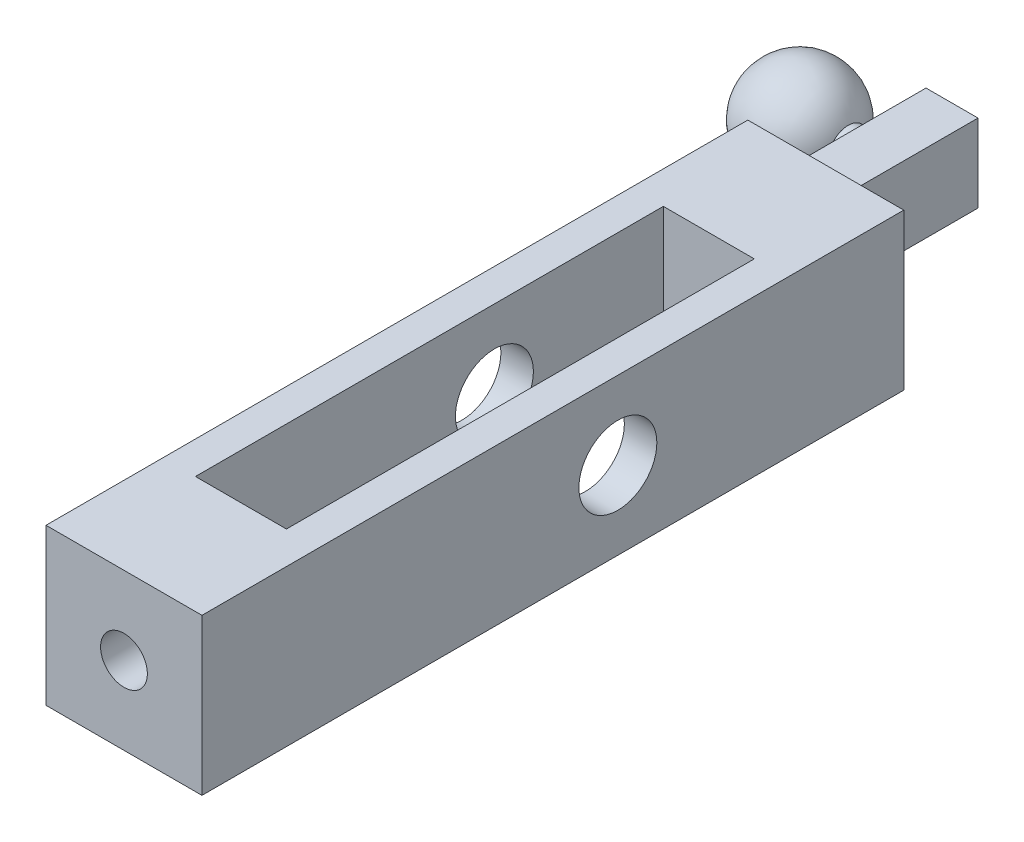
ISO-10303-21;
HEADER;
FILE_DESCRIPTION(('STEP AP214'),'2;1');
FILE_NAME('part.step','',(''),(''),'','','');
FILE_SCHEMA(('AUTOMOTIVE_DESIGN { 1 0 10303 214 1 1 1 1 }'));
ENDSEC;
DATA;
#1=APPLICATION_CONTEXT('core data for automotive mechanical design processes');
#2=APPLICATION_PROTOCOL_DEFINITION('international standard','automotive_design',2000,#1);
#3=PRODUCT_CONTEXT('',#1,'mechanical');
#4=PRODUCT('Part','Part','',(#3));
#5=PRODUCT_RELATED_PRODUCT_CATEGORY('part','',(#4));
#6=PRODUCT_DEFINITION_FORMATION('','',#4);
#7=PRODUCT_DEFINITION_CONTEXT('part definition',#1,'design');
#8=PRODUCT_DEFINITION('design','',#6,#7);
#9=PRODUCT_DEFINITION_SHAPE('','',#8);
#10=(LENGTH_UNIT() NAMED_UNIT(*) SI_UNIT(.MILLI.,.METRE.));
#11=(NAMED_UNIT(*) PLANE_ANGLE_UNIT() SI_UNIT($,.RADIAN.));
#12=(NAMED_UNIT(*) SI_UNIT($,.STERADIAN.) SOLID_ANGLE_UNIT());
#13=UNCERTAINTY_MEASURE_WITH_UNIT(LENGTH_MEASURE(1.E-05),#10,'distance_accuracy_value','');
#14=(GEOMETRIC_REPRESENTATION_CONTEXT(3) GLOBAL_UNCERTAINTY_ASSIGNED_CONTEXT((#13)) GLOBAL_UNIT_ASSIGNED_CONTEXT((#10,
#11,#12)) REPRESENTATION_CONTEXT('',''));
#15=CARTESIAN_POINT('',(0.,0.,0.));
#16=DIRECTION('',(0.,0.,1.));
#17=DIRECTION('',(1.,0.,0.));
#18=AXIS2_PLACEMENT_3D('',#15,#16,#17);
#19=CARTESIAN_POINT('',(3.,-3.,-27.));
#20=DIRECTION('',(0.,1.,0.));
#21=DIRECTION('',(-1.,0.,0.));
#22=AXIS2_PLACEMENT_3D('',#19,#20,#21);
#23=PLANE('',#22);
#24=DIRECTION('',(1.,0.,0.));
#25=VECTOR('',#24,1.);
#26=CARTESIAN_POINT('',(3.,-3.,0.));
#27=LINE('',#26,#25);
#28=CARTESIAN_POINT('',(-3.,-3.,0.));
#29=VERTEX_POINT('',#28);
#30=CARTESIAN_POINT('',(3.,-3.,0.));
#31=VERTEX_POINT('',#30);
#32=EDGE_CURVE('E224',#29,#31,#27,.T.);
#33=ORIENTED_EDGE('',*,*,#32,.F.);
#34=DIRECTION('',(0.,0.,1.));
#35=VECTOR('',#34,1.);
#36=CARTESIAN_POINT('',(-3.,-3.,-27.));
#37=LINE('',#36,#35);
#38=CARTESIAN_POINT('',(-3.,-3.,-27.));
#39=VERTEX_POINT('',#38);
#40=EDGE_CURVE('E52',#39,#29,#37,.T.);
#41=ORIENTED_EDGE('',*,*,#40,.F.);
#42=DIRECTION('',(1.,0.,0.));
#43=VECTOR('',#42,1.);
#44=CARTESIAN_POINT('',(3.,-3.,-27.));
#45=LINE('',#44,#43);
#46=CARTESIAN_POINT('',(3.,-3.,-27.));
#47=VERTEX_POINT('',#46);
#48=EDGE_CURVE('E213',#39,#47,#45,.T.);
#49=ORIENTED_EDGE('',*,*,#48,.T.);
#50=DIRECTION('',(0.,0.,1.));
#51=VECTOR('',#50,1.);
#52=CARTESIAN_POINT('',(3.,-3.,-27.));
#53=LINE('',#52,#51);
#54=EDGE_CURVE('E236',#47,#31,#53,.T.);
#55=ORIENTED_EDGE('',*,*,#54,.T.);
#56=EDGE_LOOP('',(#33,#41,#49,#55));
#57=FACE_BOUND('',#56,.T.);
#58=DIRECTION('',(1.,0.,0.));
#59=VECTOR('',#58,1.);
#60=CARTESIAN_POINT('',(3.,-3.,-4.5));
#61=LINE('',#60,#59);
#62=CARTESIAN_POINT('',(-1.75,-3.,-4.5));
#63=VERTEX_POINT('',#62);
#64=CARTESIAN_POINT('',(1.75,-3.,-4.5));
#65=VERTEX_POINT('',#64);
#66=EDGE_CURVE('E174',#63,#65,#61,.T.);
#67=ORIENTED_EDGE('',*,*,#66,.T.);
#68=DIRECTION('',(0.,0.,-1.));
#69=VECTOR('',#68,1.);
#70=CARTESIAN_POINT('',(1.75,-3.,-27.));
#71=LINE('',#70,#69);
#72=CARTESIAN_POINT('',(1.75,-3.,-22.5));
#73=VERTEX_POINT('',#72);
#74=EDGE_CURVE('E142',#65,#73,#71,.T.);
#75=ORIENTED_EDGE('',*,*,#74,.T.);
#76=DIRECTION('',(-1.,0.,0.));
#77=VECTOR('',#76,1.);
#78=CARTESIAN_POINT('',(3.,-3.,-22.5));
#79=LINE('',#78,#77);
#80=CARTESIAN_POINT('',(-1.75,-3.,-22.5));
#81=VERTEX_POINT('',#80);
#82=EDGE_CURVE('E170',#73,#81,#79,.T.);
#83=ORIENTED_EDGE('',*,*,#82,.T.);
#84=DIRECTION('',(0.,0.,1.));
#85=VECTOR('',#84,1.);
#86=CARTESIAN_POINT('',(-1.75,-3.,-27.));
#87=LINE('',#86,#85);
#88=EDGE_CURVE('E144',#81,#63,#87,.T.);
#89=ORIENTED_EDGE('',*,*,#88,.T.);
#90=EDGE_LOOP('',(#67,#75,#83,#89));
#91=FACE_BOUND('',#90,.T.);
#92=ADVANCED_FACE('F43',(#57,#91),#23,.F.);
#93=CARTESIAN_POINT('',(3.,3.,-27.));
#94=DIRECTION('',(0.,-1.,0.));
#95=DIRECTION('',(1.,0.,0.));
#96=AXIS2_PLACEMENT_3D('',#93,#94,#95);
#97=PLANE('',#96);
#98=DIRECTION('',(-1.,0.,0.));
#99=VECTOR('',#98,1.);
#100=CARTESIAN_POINT('',(3.,3.,0.));
#101=LINE('',#100,#99);
#102=CARTESIAN_POINT('',(3.,3.,0.));
#103=VERTEX_POINT('',#102);
#104=CARTESIAN_POINT('',(-3.,3.,0.));
#105=VERTEX_POINT('',#104);
#106=EDGE_CURVE('E214',#103,#105,#101,.T.);
#107=ORIENTED_EDGE('',*,*,#106,.F.);
#108=DIRECTION('',(0.,0.,1.));
#109=VECTOR('',#108,1.);
#110=CARTESIAN_POINT('',(3.,3.,-27.));
#111=LINE('',#110,#109);
#112=CARTESIAN_POINT('',(3.,3.,-27.));
#113=VERTEX_POINT('',#112);
#114=EDGE_CURVE('E233',#113,#103,#111,.T.);
#115=ORIENTED_EDGE('',*,*,#114,.F.);
#116=DIRECTION('',(-1.,0.,0.));
#117=VECTOR('',#116,1.);
#118=CARTESIAN_POINT('',(3.,3.,-27.));
#119=LINE('',#118,#117);
#120=CARTESIAN_POINT('',(-3.,3.,-27.));
#121=VERTEX_POINT('',#120);
#122=EDGE_CURVE('E219',#113,#121,#119,.T.);
#123=ORIENTED_EDGE('',*,*,#122,.T.);
#124=DIRECTION('',(0.,0.,1.));
#125=VECTOR('',#124,1.);
#126=CARTESIAN_POINT('',(-3.,3.,-27.));
#127=LINE('',#126,#125);
#128=EDGE_CURVE('E222',#121,#105,#127,.T.);
#129=ORIENTED_EDGE('',*,*,#128,.T.);
#130=EDGE_LOOP('',(#107,#115,#123,#129));
#131=FACE_BOUND('',#130,.T.);
#132=DIRECTION('',(1.,0.,0.));
#133=VECTOR('',#132,1.);
#134=CARTESIAN_POINT('',(-1.75,3.,-4.5));
#135=LINE('',#134,#133);
#136=CARTESIAN_POINT('',(-1.75,3.,-4.5));
#137=VERTEX_POINT('',#136);
#138=CARTESIAN_POINT('',(1.75,3.,-4.5));
#139=VERTEX_POINT('',#138);
#140=EDGE_CURVE('E151',#137,#139,#135,.T.);
#141=ORIENTED_EDGE('',*,*,#140,.F.);
#142=DIRECTION('',(0.,0.,1.));
#143=VECTOR('',#142,1.);
#144=CARTESIAN_POINT('',(-1.75,3.,-4.5));
#145=LINE('',#144,#143);
#146=CARTESIAN_POINT('',(-1.75,3.,-22.5));
#147=VERTEX_POINT('',#146);
#148=EDGE_CURVE('E163',#147,#137,#145,.T.);
#149=ORIENTED_EDGE('',*,*,#148,.F.);
#150=DIRECTION('',(-1.,0.,0.));
#151=VECTOR('',#150,1.);
#152=CARTESIAN_POINT('',(-1.75,3.,-22.5));
#153=LINE('',#152,#151);
#154=CARTESIAN_POINT('',(1.75,3.,-22.5));
#155=VERTEX_POINT('',#154);
#156=EDGE_CURVE('E152',#155,#147,#153,.T.);
#157=ORIENTED_EDGE('',*,*,#156,.F.);
#158=DIRECTION('',(0.,0.,-1.));
#159=VECTOR('',#158,1.);
#160=CARTESIAN_POINT('',(1.75,3.,-4.5));
#161=LINE('',#160,#159);
#162=EDGE_CURVE('E139',#139,#155,#161,.T.);
#163=ORIENTED_EDGE('',*,*,#162,.F.);
#164=EDGE_LOOP('',(#141,#149,#157,#163));
#165=FACE_BOUND('',#164,.T.);
#166=ADVANCED_FACE('F149',(#131,#165),#97,.F.);
#167=CARTESIAN_POINT('',(0.,0.,-27.));
#168=DIRECTION('',(0.,0.,-1.));
#169=DIRECTION('',(1.,0.,0.));
#170=AXIS2_PLACEMENT_3D('',#167,#168,#169);
#171=PLANE('',#170);
#172=DIRECTION('',(0.,-1.,0.));
#173=VECTOR('',#172,1.);
#174=CARTESIAN_POINT('',(-3.,-3.,-27.));
#175=LINE('',#174,#173);
#176=EDGE_CURVE('E211',#121,#39,#175,.T.);
#177=ORIENTED_EDGE('',*,*,#176,.F.);
#178=ORIENTED_EDGE('',*,*,#122,.F.);
#179=DIRECTION('',(0.,1.,0.));
#180=VECTOR('',#179,1.);
#181=CARTESIAN_POINT('',(3.,-3.,-27.));
#182=LINE('',#181,#180);
#183=EDGE_CURVE('E217',#47,#113,#182,.T.);
#184=ORIENTED_EDGE('',*,*,#183,.F.);
#185=ORIENTED_EDGE('',*,*,#48,.F.);
#186=EDGE_LOOP('',(#177,#178,#184,#185));
#187=FACE_BOUND('',#186,.T.);
#188=DIRECTION('',(-1.,0.,0.));
#189=VECTOR('',#188,1.);
#190=CARTESIAN_POINT('',(-2.14479354998716,1.49545918544692,-27.));
#191=LINE('',#190,#189);
#192=CARTESIAN_POINT('',(-0.144793549987163,1.49545918544692,-27.));
#193=VERTEX_POINT('',#192);
#194=CARTESIAN_POINT('',(-2.14479354998716,1.49545918544692,-27.));
#195=VERTEX_POINT('',#194);
#196=EDGE_CURVE('E195',#193,#195,#191,.T.);
#197=ORIENTED_EDGE('',*,*,#196,.T.);
#198=DIRECTION('',(0.,-1.,0.));
#199=VECTOR('',#198,1.);
#200=CARTESIAN_POINT('',(-2.14479354998716,1.49545918544692,-27.));
#201=LINE('',#200,#199);
#202=CARTESIAN_POINT('',(-2.14479354998716,-1.50454081455308,-27.));
#203=VERTEX_POINT('',#202);
#204=EDGE_CURVE('E198',#195,#203,#201,.T.);
#205=ORIENTED_EDGE('',*,*,#204,.T.);
#206=DIRECTION('',(1.,0.,0.));
#207=VECTOR('',#206,1.);
#208=CARTESIAN_POINT('',(-2.14479354998716,-1.50454081455308,-27.));
#209=LINE('',#208,#207);
#210=CARTESIAN_POINT('',(-0.144793549987163,-1.50454081455308,-27.));
#211=VERTEX_POINT('',#210);
#212=EDGE_CURVE('E184',#203,#211,#209,.T.);
#213=ORIENTED_EDGE('',*,*,#212,.T.);
#214=DIRECTION('',(0.,1.,0.));
#215=VECTOR('',#214,1.);
#216=CARTESIAN_POINT('',(-0.144793549987163,1.49545918544692,-27.));
#217=LINE('',#216,#215);
#218=EDGE_CURVE('E179',#211,#193,#217,.T.);
#219=ORIENTED_EDGE('',*,*,#218,.T.);
#220=EDGE_LOOP('',(#197,#205,#213,#219));
#221=FACE_BOUND('',#220,.T.);
#222=ADVANCED_FACE('F276',(#187,#221),#171,.T.);
#223=CARTESIAN_POINT('',(-3.,-3.,-27.));
#224=DIRECTION('',(1.,0.,0.));
#225=DIRECTION('',(0.,0.,1.));
#226=AXIS2_PLACEMENT_3D('',#223,#224,#225);
#227=PLANE('',#226);
#228=CARTESIAN_POINT('',(-3.,0.,-16.));
#229=DIRECTION('',(1.,0.,0.));
#230=DIRECTION('',(0.,0.,-1.));
#231=AXIS2_PLACEMENT_3D('',#228,#229,#230);
#232=CIRCLE('',#231,1.5);
#233=CARTESIAN_POINT('',(-3.,0.,-17.5));
#234=VERTEX_POINT('',#233);
#235=EDGE_CURVE('E242',#234,#234,#232,.T.);
#236=ORIENTED_EDGE('',*,*,#235,.T.);
#237=EDGE_LOOP('',(#236));
#238=FACE_BOUND('',#237,.T.);
#239=DIRECTION('',(0.,-1.,0.));
#240=VECTOR('',#239,1.);
#241=CARTESIAN_POINT('',(-3.,-3.,0.));
#242=LINE('',#241,#240);
#243=EDGE_CURVE('E210',#105,#29,#242,.T.);
#244=ORIENTED_EDGE('',*,*,#243,.F.);
#245=ORIENTED_EDGE('',*,*,#128,.F.);
#246=ORIENTED_EDGE('',*,*,#176,.T.);
#247=ORIENTED_EDGE('',*,*,#40,.T.);
#248=EDGE_LOOP('',(#244,#245,#246,#247));
#249=FACE_BOUND('',#248,.T.);
#250=ADVANCED_FACE('F45',(#238,#249),#227,.F.);
#251=CARTESIAN_POINT('',(3.,-3.,-27.));
#252=DIRECTION('',(-1.,0.,0.));
#253=DIRECTION('',(0.,0.,-1.));
#254=AXIS2_PLACEMENT_3D('',#251,#252,#253);
#255=PLANE('',#254);
#256=CARTESIAN_POINT('',(3.,0.,-16.));
#257=DIRECTION('',(1.,0.,0.));
#258=DIRECTION('',(0.,0.,-1.));
#259=AXIS2_PLACEMENT_3D('',#256,#257,#258);
#260=CIRCLE('',#259,1.5);
#261=CARTESIAN_POINT('',(3.,0.,-17.5));
#262=VERTEX_POINT('',#261);
#263=EDGE_CURVE('E155',#262,#262,#260,.T.);
#264=ORIENTED_EDGE('',*,*,#263,.F.);
#265=EDGE_LOOP('',(#264));
#266=FACE_BOUND('',#265,.T.);
#267=DIRECTION('',(0.,1.,0.));
#268=VECTOR('',#267,1.);
#269=CARTESIAN_POINT('',(3.,-3.,0.));
#270=LINE('',#269,#268);
#271=EDGE_CURVE('E227',#31,#103,#270,.T.);
#272=ORIENTED_EDGE('',*,*,#271,.F.);
#273=ORIENTED_EDGE('',*,*,#54,.F.);
#274=ORIENTED_EDGE('',*,*,#183,.T.);
#275=ORIENTED_EDGE('',*,*,#114,.T.);
#276=EDGE_LOOP('',(#272,#273,#274,#275));
#277=FACE_BOUND('',#276,.T.);
#278=ADVANCED_FACE('F282',(#266,#277),#255,.F.);
#279=CARTESIAN_POINT('',(0.,0.,0.));
#280=DIRECTION('',(0.,0.,-1.));
#281=DIRECTION('',(1.,0.,0.));
#282=AXIS2_PLACEMENT_3D('',#279,#280,#281);
#283=PLANE('',#282);
#284=CARTESIAN_POINT('',(0.,0.,0.));
#285=DIRECTION('',(0.,0.,-1.));
#286=DIRECTION('',(-1.,0.,0.));
#287=AXIS2_PLACEMENT_3D('',#284,#285,#286);
#288=CIRCLE('',#287,0.9);
#289=CARTESIAN_POINT('',(-0.9,0.,0.));
#290=VERTEX_POINT('',#289);
#291=EDGE_CURVE('E251',#290,#290,#288,.T.);
#292=ORIENTED_EDGE('',*,*,#291,.T.);
#293=EDGE_LOOP('',(#292));
#294=FACE_BOUND('',#293,.T.);
#295=ORIENTED_EDGE('',*,*,#243,.T.);
#296=ORIENTED_EDGE('',*,*,#32,.T.);
#297=ORIENTED_EDGE('',*,*,#271,.T.);
#298=ORIENTED_EDGE('',*,*,#106,.T.);
#299=EDGE_LOOP('',(#295,#296,#297,#298));
#300=FACE_BOUND('',#299,.T.);
#301=ADVANCED_FACE('F256',(#294,#300),#283,.F.);
#302=CARTESIAN_POINT('',(-0.144793549987163,1.49545918544692,-33.));
#303=DIRECTION('',(-1.,0.,0.));
#304=DIRECTION('',(0.,-1.,0.));
#305=AXIS2_PLACEMENT_3D('',#302,#303,#304);
#306=PLANE('',#305);
#307=ORIENTED_EDGE('',*,*,#218,.F.);
#308=DIRECTION('',(0.,0.,1.));
#309=VECTOR('',#308,1.);
#310=CARTESIAN_POINT('',(-0.144793549987163,-1.50454081455308,-33.));
#311=LINE('',#310,#309);
#312=CARTESIAN_POINT('',(-0.144793549987163,-1.50454081455308,-33.));
#313=VERTEX_POINT('',#312);
#314=EDGE_CURVE('E192',#313,#211,#311,.T.);
#315=ORIENTED_EDGE('',*,*,#314,.F.);
#316=DIRECTION('',(0.,1.,0.));
#317=VECTOR('',#316,1.);
#318=CARTESIAN_POINT('',(-0.144793549987163,1.49545918544692,-33.));
#319=LINE('',#318,#317);
#320=CARTESIAN_POINT('',(-0.144793549987163,1.49545918544692,-33.));
#321=VERTEX_POINT('',#320);
#322=EDGE_CURVE('E180',#313,#321,#319,.T.);
#323=ORIENTED_EDGE('',*,*,#322,.T.);
#324=DIRECTION('',(0.,0.,1.));
#325=VECTOR('',#324,1.);
#326=CARTESIAN_POINT('',(-0.144793549987163,1.49545918544692,-33.));
#327=LINE('',#326,#325);
#328=EDGE_CURVE('E208',#321,#193,#327,.T.);
#329=ORIENTED_EDGE('',*,*,#328,.T.);
#330=EDGE_LOOP('',(#307,#315,#323,#329));
#331=FACE_BOUND('',#330,.T.);
#332=ADVANCED_FACE('F288',(#331),#306,.F.);
#333=CARTESIAN_POINT('',(-2.14479354998716,1.49545918544692,-33.));
#334=DIRECTION('',(0.,-1.,0.));
#335=DIRECTION('',(1.,0.,0.));
#336=AXIS2_PLACEMENT_3D('',#333,#334,#335);
#337=PLANE('',#336);
#338=ORIENTED_EDGE('',*,*,#196,.F.);
#339=ORIENTED_EDGE('',*,*,#328,.F.);
#340=DIRECTION('',(-1.,0.,0.));
#341=VECTOR('',#340,1.);
#342=CARTESIAN_POINT('',(-2.14479354998716,1.49545918544692,-33.));
#343=LINE('',#342,#341);
#344=CARTESIAN_POINT('',(-2.14479354998716,1.49545918544692,-33.));
#345=VERTEX_POINT('',#344);
#346=EDGE_CURVE('E183',#321,#345,#343,.T.);
#347=ORIENTED_EDGE('',*,*,#346,.T.);
#348=DIRECTION('',(0.,0.,1.));
#349=VECTOR('',#348,1.);
#350=CARTESIAN_POINT('',(-2.14479354998716,1.49545918544692,-33.));
#351=LINE('',#350,#349);
#352=EDGE_CURVE('E206',#345,#195,#351,.T.);
#353=ORIENTED_EDGE('',*,*,#352,.T.);
#354=EDGE_LOOP('',(#338,#339,#347,#353));
#355=FACE_BOUND('',#354,.T.);
#356=ADVANCED_FACE('F294',(#355),#337,.F.);
#357=CARTESIAN_POINT('',(-2.14479354998716,1.49545918544692,-33.));
#358=DIRECTION('',(1.,0.,0.));
#359=DIRECTION('',(0.,1.,0.));
#360=AXIS2_PLACEMENT_3D('',#357,#358,#359);
#361=PLANE('',#360);
#362=CARTESIAN_POINT('',(-2.14479354998716,0.,-31.));
#363=DIRECTION('',(-1.,0.,0.));
#364=DIRECTION('',(0.,1.,0.));
#365=AXIS2_PLACEMENT_3D('',#362,#363,#364);
#366=CIRCLE('',#365,0.749999999999999);
#367=CARTESIAN_POINT('',(-2.14479354998716,0.749999999999998,-31.));
#368=VERTEX_POINT('',#367);
#369=EDGE_CURVE('E11',#368,#368,#366,.F.);
#370=ORIENTED_EDGE('',*,*,#369,.T.);
#371=EDGE_LOOP('',(#370));
#372=FACE_BOUND('',#371,.T.);
#373=ORIENTED_EDGE('',*,*,#204,.F.);
#374=ORIENTED_EDGE('',*,*,#352,.F.);
#375=DIRECTION('',(0.,-1.,0.));
#376=VECTOR('',#375,1.);
#377=CARTESIAN_POINT('',(-2.14479354998716,1.49545918544692,-33.));
#378=LINE('',#377,#376);
#379=CARTESIAN_POINT('',(-2.14479354998716,-1.50454081455308,-33.));
#380=VERTEX_POINT('',#379);
#381=EDGE_CURVE('E187',#345,#380,#378,.T.);
#382=ORIENTED_EDGE('',*,*,#381,.T.);
#383=DIRECTION('',(0.,0.,1.));
#384=VECTOR('',#383,1.);
#385=CARTESIAN_POINT('',(-2.14479354998716,-1.50454081455308,-33.));
#386=LINE('',#385,#384);
#387=EDGE_CURVE('E204',#380,#203,#386,.T.);
#388=ORIENTED_EDGE('',*,*,#387,.T.);
#389=EDGE_LOOP('',(#373,#374,#382,#388));
#390=FACE_BOUND('',#389,.T.);
#391=ADVANCED_FACE('F298',(#372,#390),#361,.F.);
#392=CARTESIAN_POINT('',(-2.14479354998716,-1.50454081455308,-33.));
#393=DIRECTION('',(0.,1.,0.));
#394=DIRECTION('',(-1.,0.,0.));
#395=AXIS2_PLACEMENT_3D('',#392,#393,#394);
#396=PLANE('',#395);
#397=ORIENTED_EDGE('',*,*,#212,.F.);
#398=ORIENTED_EDGE('',*,*,#387,.F.);
#399=DIRECTION('',(1.,0.,0.));
#400=VECTOR('',#399,1.);
#401=CARTESIAN_POINT('',(-2.14479354998716,-1.50454081455308,-33.));
#402=LINE('',#401,#400);
#403=EDGE_CURVE('E190',#380,#313,#402,.T.);
#404=ORIENTED_EDGE('',*,*,#403,.T.);
#405=ORIENTED_EDGE('',*,*,#314,.T.);
#406=EDGE_LOOP('',(#397,#398,#404,#405));
#407=FACE_BOUND('',#406,.T.);
#408=ADVANCED_FACE('F302',(#407),#396,.F.);
#409=CARTESIAN_POINT('',(0.,0.,-33.));
#410=DIRECTION('',(0.,0.,-1.));
#411=DIRECTION('',(1.,0.,0.));
#412=AXIS2_PLACEMENT_3D('',#409,#410,#411);
#413=PLANE('',#412);
#414=ORIENTED_EDGE('',*,*,#322,.F.);
#415=ORIENTED_EDGE('',*,*,#403,.F.);
#416=ORIENTED_EDGE('',*,*,#381,.F.);
#417=ORIENTED_EDGE('',*,*,#346,.F.);
#418=EDGE_LOOP('',(#414,#415,#416,#417));
#419=FACE_BOUND('',#418,.T.);
#420=ADVANCED_FACE('F306',(#419),#413,.T.);
#421=CARTESIAN_POINT('',(-3.14479354998716,0.,-31.));
#422=DIRECTION('',(1.,0.,0.));
#423=DIRECTION('',(0.,1.,0.));
#424=AXIS2_PLACEMENT_3D('',#421,#422,#423);
#425=CYLINDRICAL_SURFACE('',#424,0.749999999999999);
#426=CARTESIAN_POINT('',(-3.14479354998716,0.,-31.));
#427=DIRECTION('',(1.,0.,0.));
#428=DIRECTION('',(0.,-1.,0.));
#429=AXIS2_PLACEMENT_3D('',#426,#427,#428);
#430=CIRCLE('',#429,0.749999999999999);
#431=CARTESIAN_POINT('',(-3.14479354998716,-0.749999999999999,-31.));
#432=VERTEX_POINT('',#431);
#433=EDGE_CURVE('E176',#432,#432,#430,.T.);
#434=ORIENTED_EDGE('',*,*,#433,.T.);
#435=EDGE_LOOP('',(#434));
#436=FACE_BOUND('',#435,.T.);
#437=ORIENTED_EDGE('',*,*,#369,.F.);
#438=EDGE_LOOP('',(#437));
#439=FACE_BOUND('',#438,.T.);
#440=ADVANCED_FACE('F310',(#436,#439),#425,.T.);
#441=CARTESIAN_POINT('',(-4.99884317176108,0.,-31.));
#442=DIRECTION('',(1.,0.,0.));
#443=DIRECTION('',(0.,0.,1.));
#444=AXIS2_PLACEMENT_3D('',#441,#442,#443);
#445=SPHERICAL_SURFACE('',#444,2.);
#446=ORIENTED_EDGE('',*,*,#433,.F.);
#447=EDGE_LOOP('',(#446));
#448=FACE_BOUND('',#447,.T.);
#449=ADVANCED_FACE('F314',(#448),#445,.T.);
#450=CARTESIAN_POINT('',(-1.75,-5.,-4.5));
#451=DIRECTION('',(0.,0.,-1.));
#452=DIRECTION('',(1.,0.,0.));
#453=AXIS2_PLACEMENT_3D('',#450,#451,#452);
#454=PLANE('',#453);
#455=CARTESIAN_POINT('',(0.,0.,-4.5));
#456=DIRECTION('',(0.,0.,1.));
#457=DIRECTION('',(1.,0.,0.));
#458=AXIS2_PLACEMENT_3D('',#455,#456,#457);
#459=CIRCLE('',#458,0.9);
#460=CARTESIAN_POINT('',(0.9,0.,-4.5));
#461=VERTEX_POINT('',#460);
#462=EDGE_CURVE('E47',#461,#461,#459,.T.);
#463=ORIENTED_EDGE('',*,*,#462,.T.);
#464=EDGE_LOOP('',(#463));
#465=FACE_BOUND('',#464,.T.);
#466=ORIENTED_EDGE('',*,*,#66,.F.);
#467=DIRECTION('',(0.,1.,0.));
#468=VECTOR('',#467,1.);
#469=CARTESIAN_POINT('',(-1.75,-5.,-4.5));
#470=LINE('',#469,#468);
#471=EDGE_CURVE('E68',#63,#137,#470,.T.);
#472=ORIENTED_EDGE('',*,*,#471,.T.);
#473=ORIENTED_EDGE('',*,*,#140,.T.);
#474=DIRECTION('',(0.,1.,0.));
#475=VECTOR('',#474,1.);
#476=CARTESIAN_POINT('',(1.75,-5.,-4.5));
#477=LINE('',#476,#475);
#478=EDGE_CURVE('E136',#65,#139,#477,.T.);
#479=ORIENTED_EDGE('',*,*,#478,.F.);
#480=EDGE_LOOP('',(#466,#472,#473,#479));
#481=FACE_BOUND('',#480,.T.);
#482=ADVANCED_FACE('F154',(#465,#481),#454,.T.);
#483=CARTESIAN_POINT('',(1.75,-5.,-4.5));
#484=DIRECTION('',(-1.,0.,0.));
#485=DIRECTION('',(0.,-1.,0.));
#486=AXIS2_PLACEMENT_3D('',#483,#484,#485);
#487=PLANE('',#486);
#488=CARTESIAN_POINT('',(1.75,0.,-16.));
#489=DIRECTION('',(1.,0.,0.));
#490=DIRECTION('',(0.,-1.,0.));
#491=AXIS2_PLACEMENT_3D('',#488,#489,#490);
#492=CIRCLE('',#491,1.5);
#493=CARTESIAN_POINT('',(1.75,-1.5,-16.));
#494=VERTEX_POINT('',#493);
#495=EDGE_CURVE('E158',#494,#494,#492,.T.);
#496=ORIENTED_EDGE('',*,*,#495,.T.);
#497=EDGE_LOOP('',(#496));
#498=FACE_BOUND('',#497,.T.);
#499=ORIENTED_EDGE('',*,*,#74,.F.);
#500=ORIENTED_EDGE('',*,*,#478,.T.);
#501=ORIENTED_EDGE('',*,*,#162,.T.);
#502=DIRECTION('',(0.,1.,0.));
#503=VECTOR('',#502,1.);
#504=CARTESIAN_POINT('',(1.75,-5.,-22.5));
#505=LINE('',#504,#503);
#506=EDGE_CURVE('E145',#73,#155,#505,.T.);
#507=ORIENTED_EDGE('',*,*,#506,.F.);
#508=EDGE_LOOP('',(#499,#500,#501,#507));
#509=FACE_BOUND('',#508,.T.);
#510=ADVANCED_FACE('F138',(#498,#509),#487,.T.);
#511=CARTESIAN_POINT('',(-1.75000000000001,-5.,-22.5));
#512=DIRECTION('',(0.,0.,1.));
#513=DIRECTION('',(-1.,0.,0.));
#514=AXIS2_PLACEMENT_3D('',#511,#512,#513);
#515=PLANE('',#514);
#516=ORIENTED_EDGE('',*,*,#82,.F.);
#517=ORIENTED_EDGE('',*,*,#506,.T.);
#518=ORIENTED_EDGE('',*,*,#156,.T.);
#519=DIRECTION('',(0.,1.,0.));
#520=VECTOR('',#519,1.);
#521=CARTESIAN_POINT('',(-1.75000000000001,-5.,-22.5));
#522=LINE('',#521,#520);
#523=EDGE_CURVE('E60',#81,#147,#522,.T.);
#524=ORIENTED_EDGE('',*,*,#523,.F.);
#525=EDGE_LOOP('',(#516,#517,#518,#524));
#526=FACE_BOUND('',#525,.T.);
#527=ADVANCED_FACE('F324',(#526),#515,.T.);
#528=CARTESIAN_POINT('',(-1.75,-5.,-4.5));
#529=DIRECTION('',(1.,0.,0.));
#530=DIRECTION('',(0.,1.,0.));
#531=AXIS2_PLACEMENT_3D('',#528,#529,#530);
#532=PLANE('',#531);
#533=CARTESIAN_POINT('',(-1.75,0.,-16.));
#534=DIRECTION('',(-1.,0.,0.));
#535=DIRECTION('',(0.,1.,0.));
#536=AXIS2_PLACEMENT_3D('',#533,#534,#535);
#537=CIRCLE('',#536,1.5);
#538=CARTESIAN_POINT('',(-1.75,1.5,-16.));
#539=VERTEX_POINT('',#538);
#540=EDGE_CURVE('E240',#539,#539,#537,.T.);
#541=ORIENTED_EDGE('',*,*,#540,.T.);
#542=EDGE_LOOP('',(#541));
#543=FACE_BOUND('',#542,.T.);
#544=ORIENTED_EDGE('',*,*,#88,.F.);
#545=ORIENTED_EDGE('',*,*,#523,.T.);
#546=ORIENTED_EDGE('',*,*,#148,.T.);
#547=ORIENTED_EDGE('',*,*,#471,.F.);
#548=EDGE_LOOP('',(#544,#545,#546,#547));
#549=FACE_BOUND('',#548,.T.);
#550=ADVANCED_FACE('F328',(#543,#549),#532,.T.);
#551=CARTESIAN_POINT('',(5.,0.,-16.));
#552=DIRECTION('',(-1.,0.,0.));
#553=DIRECTION('',(0.,0.,-1.));
#554=AXIS2_PLACEMENT_3D('',#551,#552,#553);
#555=CYLINDRICAL_SURFACE('',#554,1.5);
#556=ORIENTED_EDGE('',*,*,#540,.F.);
#557=EDGE_LOOP('',(#556));
#558=FACE_BOUND('',#557,.T.);
#559=ORIENTED_EDGE('',*,*,#235,.F.);
#560=EDGE_LOOP('',(#559));
#561=FACE_BOUND('',#560,.T.);
#562=ADVANCED_FACE('F267',(#558,#561),#555,.F.);
#563=ORIENTED_EDGE('',*,*,#495,.F.);
#564=EDGE_LOOP('',(#563));
#565=FACE_BOUND('',#564,.T.);
#566=ORIENTED_EDGE('',*,*,#263,.T.);
#567=EDGE_LOOP('',(#566));
#568=FACE_BOUND('',#567,.T.);
#569=ADVANCED_FACE('F261',(#565,#568),#555,.F.);
#570=CARTESIAN_POINT('',(0.,0.,-8.));
#571=DIRECTION('',(0.,0.,1.));
#572=DIRECTION('',(-1.,0.,0.));
#573=AXIS2_PLACEMENT_3D('',#570,#571,#572);
#574=CYLINDRICAL_SURFACE('',#573,0.9);
#575=ORIENTED_EDGE('',*,*,#462,.F.);
#576=EDGE_LOOP('',(#575));
#577=FACE_BOUND('',#576,.T.);
#578=ORIENTED_EDGE('',*,*,#291,.F.);
#579=EDGE_LOOP('',(#578));
#580=FACE_BOUND('',#579,.T.);
#581=ADVANCED_FACE('F259',(#577,#580),#574,.F.);
#582=CLOSED_SHELL('',(#92,#166,#222,#250,#278,#301,#332,#356,#391,#408,#420,#440,#449,#482,#510,
#527,#550,#562,#569,#581));
#583=MANIFOLD_SOLID_BREP('B2',#582);
#584=ADVANCED_BREP_SHAPE_REPRESENTATION('',(#18,#583),#14);
#585=SHAPE_DEFINITION_REPRESENTATION(#9,#584);
ENDSEC;
END-ISO-10303-21;
